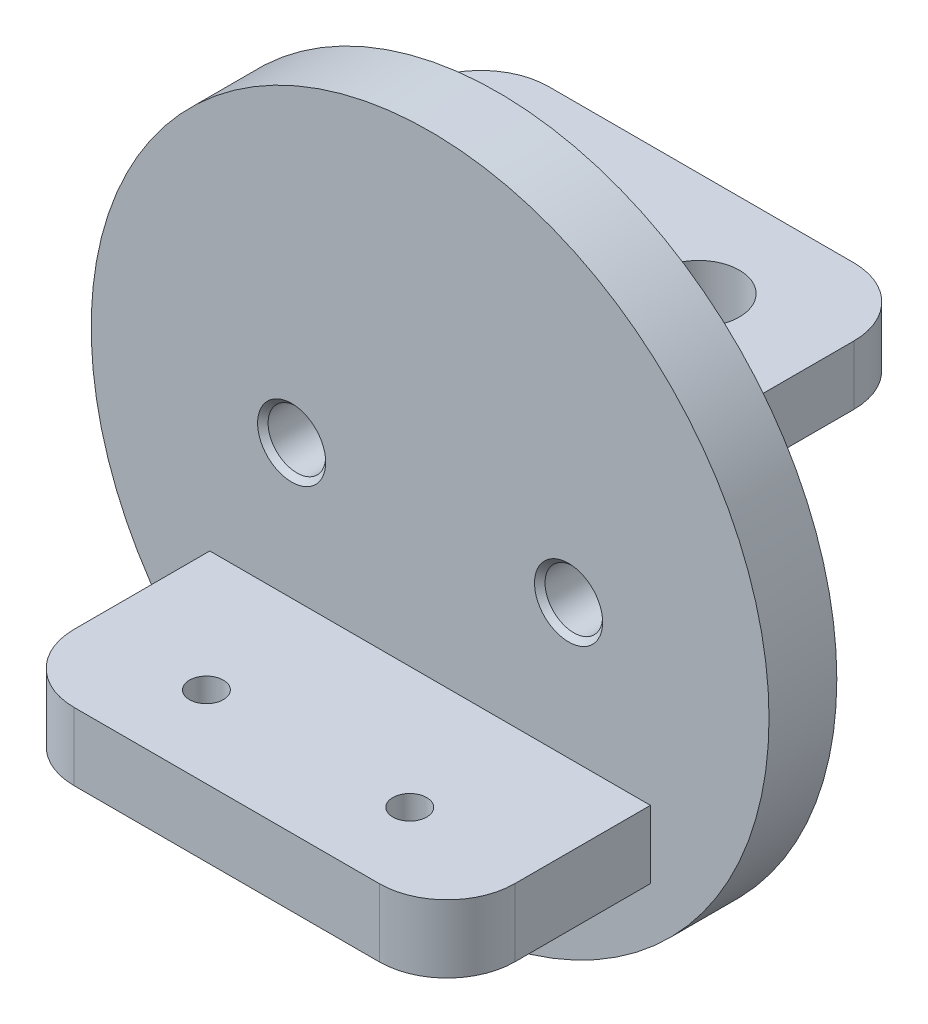
ISO-10303-21;
HEADER;
FILE_DESCRIPTION(('STEP AP214'),'2;1');
FILE_NAME('part.step','',(''),(''),'','','');
FILE_SCHEMA(('AUTOMOTIVE_DESIGN { 1 0 10303 214 1 1 1 1 }'));
ENDSEC;
DATA;
#1=APPLICATION_CONTEXT('core data for automotive mechanical design processes');
#2=APPLICATION_PROTOCOL_DEFINITION('international standard','automotive_design',2000,#1);
#3=PRODUCT_CONTEXT('',#1,'mechanical');
#4=PRODUCT('Part','Part','',(#3));
#5=PRODUCT_RELATED_PRODUCT_CATEGORY('part','',(#4));
#6=PRODUCT_DEFINITION_FORMATION('','',#4);
#7=PRODUCT_DEFINITION_CONTEXT('part definition',#1,'design');
#8=PRODUCT_DEFINITION('design','',#6,#7);
#9=PRODUCT_DEFINITION_SHAPE('','',#8);
#10=(LENGTH_UNIT() NAMED_UNIT(*) SI_UNIT(.MILLI.,.METRE.));
#11=(NAMED_UNIT(*) PLANE_ANGLE_UNIT() SI_UNIT($,.RADIAN.));
#12=(NAMED_UNIT(*) SI_UNIT($,.STERADIAN.) SOLID_ANGLE_UNIT());
#13=UNCERTAINTY_MEASURE_WITH_UNIT(LENGTH_MEASURE(1.E-05),#10,'distance_accuracy_value','');
#14=(GEOMETRIC_REPRESENTATION_CONTEXT(3) GLOBAL_UNCERTAINTY_ASSIGNED_CONTEXT((#13)) GLOBAL_UNIT_ASSIGNED_CONTEXT((#10,
#11,#12)) REPRESENTATION_CONTEXT('',''));
#15=CARTESIAN_POINT('',(0.,0.,0.));
#16=DIRECTION('',(0.,0.,1.));
#17=DIRECTION('',(1.,0.,0.));
#18=AXIS2_PLACEMENT_3D('',#15,#16,#17);
#19=CARTESIAN_POINT('',(0.,0.,10.));
#20=DIRECTION('',(0.,0.,-1.));
#21=DIRECTION('',(-1.,0.,0.));
#22=AXIS2_PLACEMENT_3D('',#19,#20,#21);
#23=CYLINDRICAL_SURFACE('',#22,50.);
#24=CARTESIAN_POINT('',(0.,0.,10.));
#25=DIRECTION('',(0.,0.,1.));
#26=DIRECTION('',(1.,0.,0.));
#27=AXIS2_PLACEMENT_3D('',#24,#25,#26);
#28=CIRCLE('',#27,50.);
#29=CARTESIAN_POINT('',(50.,0.,10.));
#30=VERTEX_POINT('',#29);
#31=EDGE_CURVE('E158',#30,#30,#28,.T.);
#32=ORIENTED_EDGE('',*,*,#31,.F.);
#33=EDGE_LOOP('',(#32));
#34=FACE_BOUND('',#33,.T.);
#35=CARTESIAN_POINT('',(0.,0.,0.));
#36=DIRECTION('',(0.,0.,1.));
#37=DIRECTION('',(1.,0.,0.));
#38=AXIS2_PLACEMENT_3D('',#35,#36,#37);
#39=CIRCLE('',#38,50.);
#40=CARTESIAN_POINT('',(50.,0.,0.));
#41=VERTEX_POINT('',#40);
#42=EDGE_CURVE('E265',#41,#41,#39,.T.);
#43=ORIENTED_EDGE('',*,*,#42,.T.);
#44=EDGE_LOOP('',(#43));
#45=FACE_BOUND('',#44,.T.);
#46=ADVANCED_FACE('F45',(#34,#45),#23,.T.);
#47=CARTESIAN_POINT('',(0.,0.,10.));
#48=DIRECTION('',(0.,0.,1.));
#49=DIRECTION('',(1.,0.,0.));
#50=AXIS2_PLACEMENT_3D('',#47,#48,#49);
#51=PLANE('',#50);
#52=DIRECTION('',(1.,0.,0.));
#53=VECTOR('',#52,1.);
#54=CARTESIAN_POINT('',(0.,-19.8649374279627,10.));
#55=LINE('',#54,#53);
#56=CARTESIAN_POINT('',(-32.5,-19.8649374279627,10.));
#57=VERTEX_POINT('',#56);
#58=CARTESIAN_POINT('',(32.5,-19.8649374279627,10.));
#59=VERTEX_POINT('',#58);
#60=EDGE_CURVE('E219',#57,#59,#55,.T.);
#61=ORIENTED_EDGE('',*,*,#60,.T.);
#62=DIRECTION('',(0.,1.,0.));
#63=VECTOR('',#62,1.);
#64=CARTESIAN_POINT('',(32.5,0.,10.));
#65=LINE('',#64,#63);
#66=CARTESIAN_POINT('',(32.5,-29.8649374279627,10.));
#67=VERTEX_POINT('',#66);
#68=EDGE_CURVE('E226',#67,#59,#65,.T.);
#69=ORIENTED_EDGE('',*,*,#68,.F.);
#70=DIRECTION('',(1.,0.,0.));
#71=VECTOR('',#70,1.);
#72=CARTESIAN_POINT('',(0.,-29.8649374279627,10.));
#73=LINE('',#72,#71);
#74=CARTESIAN_POINT('',(-32.5,-29.8649374279627,10.));
#75=VERTEX_POINT('',#74);
#76=EDGE_CURVE('E235',#75,#67,#73,.T.);
#77=ORIENTED_EDGE('',*,*,#76,.F.);
#78=DIRECTION('',(0.,1.,0.));
#79=VECTOR('',#78,1.);
#80=CARTESIAN_POINT('',(-32.5,0.,10.));
#81=LINE('',#80,#79);
#82=EDGE_CURVE('E232',#75,#57,#81,.T.);
#83=ORIENTED_EDGE('',*,*,#82,.T.);
#84=EDGE_LOOP('',(#61,#69,#77,#83));
#85=FACE_BOUND('',#84,.T.);
#86=CARTESIAN_POINT('',(20.4266717285162,0.,10.));
#87=DIRECTION('',(0.,0.,1.));
#88=DIRECTION('',(1.,0.,0.));
#89=AXIS2_PLACEMENT_3D('',#86,#87,#88);
#90=CIRCLE('',#89,5.025);
#91=CARTESIAN_POINT('',(25.4516717285162,0.,10.));
#92=VERTEX_POINT('',#91);
#93=EDGE_CURVE('E247',#92,#92,#90,.T.);
#94=ORIENTED_EDGE('',*,*,#93,.F.);
#95=EDGE_LOOP('',(#94));
#96=FACE_BOUND('',#95,.T.);
#97=CARTESIAN_POINT('',(-20.4266717285162,0.,10.));
#98=DIRECTION('',(0.,0.,1.));
#99=DIRECTION('',(1.,0.,0.));
#100=AXIS2_PLACEMENT_3D('',#97,#98,#99);
#101=CIRCLE('',#100,5.025);
#102=CARTESIAN_POINT('',(-15.4016717285162,0.,10.));
#103=VERTEX_POINT('',#102);
#104=EDGE_CURVE('E256',#103,#103,#101,.T.);
#105=ORIENTED_EDGE('',*,*,#104,.F.);
#106=EDGE_LOOP('',(#105));
#107=FACE_BOUND('',#106,.T.);
#108=ORIENTED_EDGE('',*,*,#31,.T.);
#109=EDGE_LOOP('',(#108));
#110=FACE_BOUND('',#109,.T.);
#111=ADVANCED_FACE('F280',(#85,#96,#107,#110),#51,.T.);
#112=CARTESIAN_POINT('',(0.,0.,0.));
#113=DIRECTION('',(0.,0.,1.));
#114=DIRECTION('',(1.,0.,0.));
#115=AXIS2_PLACEMENT_3D('',#112,#113,#114);
#116=PLANE('',#115);
#117=DIRECTION('',(0.,1.,0.));
#118=VECTOR('',#117,1.);
#119=CARTESIAN_POINT('',(32.5,0.,0.));
#120=LINE('',#119,#118);
#121=CARTESIAN_POINT('',(32.5,15.7061747048768,0.));
#122=VERTEX_POINT('',#121);
#123=CARTESIAN_POINT('',(32.5,24.4566671709914,0.));
#124=VERTEX_POINT('',#123);
#125=EDGE_CURVE('E163',#122,#124,#120,.T.);
#126=ORIENTED_EDGE('',*,*,#125,.T.);
#127=DIRECTION('',(-1.,0.,0.));
#128=VECTOR('',#127,1.);
#129=CARTESIAN_POINT('',(0.,24.4566671709914,0.));
#130=LINE('',#129,#128);
#131=CARTESIAN_POINT('',(-32.5,24.4566671709914,0.));
#132=VERTEX_POINT('',#131);
#133=EDGE_CURVE('E141',#124,#132,#130,.T.);
#134=ORIENTED_EDGE('',*,*,#133,.T.);
#135=DIRECTION('',(0.,-1.,0.));
#136=VECTOR('',#135,1.);
#137=CARTESIAN_POINT('',(-32.5,0.,0.));
#138=LINE('',#137,#136);
#139=CARTESIAN_POINT('',(-32.5,15.7061747048768,0.));
#140=VERTEX_POINT('',#139);
#141=EDGE_CURVE('E151',#132,#140,#138,.T.);
#142=ORIENTED_EDGE('',*,*,#141,.T.);
#143=DIRECTION('',(1.,0.,0.));
#144=VECTOR('',#143,1.);
#145=CARTESIAN_POINT('',(0.,15.7061747048768,0.));
#146=LINE('',#145,#144);
#147=EDGE_CURVE('E157',#140,#122,#146,.T.);
#148=ORIENTED_EDGE('',*,*,#147,.T.);
#149=EDGE_LOOP('',(#126,#134,#142,#148));
#150=FACE_BOUND('',#149,.T.);
#151=CARTESIAN_POINT('',(20.4266717285162,0.,0.));
#152=DIRECTION('',(0.,0.,1.));
#153=DIRECTION('',(1.,0.,0.));
#154=AXIS2_PLACEMENT_3D('',#151,#152,#153);
#155=CIRCLE('',#154,4.25);
#156=CARTESIAN_POINT('',(24.6766717285162,0.,0.));
#157=VERTEX_POINT('',#156);
#158=EDGE_CURVE('E253',#157,#157,#155,.T.);
#159=ORIENTED_EDGE('',*,*,#158,.T.);
#160=EDGE_LOOP('',(#159));
#161=FACE_BOUND('',#160,.T.);
#162=CARTESIAN_POINT('',(-20.4266717285162,0.,0.));
#163=DIRECTION('',(0.,0.,1.));
#164=DIRECTION('',(1.,0.,0.));
#165=AXIS2_PLACEMENT_3D('',#162,#163,#164);
#166=CIRCLE('',#165,4.25);
#167=CARTESIAN_POINT('',(-16.1766717285162,0.,0.));
#168=VERTEX_POINT('',#167);
#169=EDGE_CURVE('E262',#168,#168,#166,.T.);
#170=ORIENTED_EDGE('',*,*,#169,.T.);
#171=EDGE_LOOP('',(#170));
#172=FACE_BOUND('',#171,.T.);
#173=ORIENTED_EDGE('',*,*,#42,.F.);
#174=EDGE_LOOP('',(#173));
#175=FACE_BOUND('',#174,.T.);
#176=ADVANCED_FACE('F160',(#150,#161,#172,#175),#116,.F.);
#177=CARTESIAN_POINT('',(-20.4266717285162,0.,10.));
#178=DIRECTION('',(0.,0.,1.));
#179=DIRECTION('',(1.,0.,0.));
#180=AXIS2_PLACEMENT_3D('',#177,#178,#179);
#181=CYLINDRICAL_SURFACE('',#180,4.25);
#182=ORIENTED_EDGE('',*,*,#169,.F.);
#183=EDGE_LOOP('',(#182));
#184=FACE_BOUND('',#183,.T.);
#185=CARTESIAN_POINT('',(-20.4266717285162,0.,9.225));
#186=DIRECTION('',(0.,0.,1.));
#187=DIRECTION('',(1.,0.,0.));
#188=AXIS2_PLACEMENT_3D('',#185,#186,#187);
#189=CIRCLE('',#188,4.25);
#190=CARTESIAN_POINT('',(-16.1766717285162,0.,9.225));
#191=VERTEX_POINT('',#190);
#192=EDGE_CURVE('E259',#191,#191,#189,.T.);
#193=ORIENTED_EDGE('',*,*,#192,.T.);
#194=EDGE_LOOP('',(#193));
#195=FACE_BOUND('',#194,.T.);
#196=ADVANCED_FACE('F354',(#184,#195),#181,.F.);
#197=CARTESIAN_POINT('',(-20.4266717285162,0.,10.));
#198=DIRECTION('',(0.,0.,1.));
#199=DIRECTION('',(1.,0.,0.));
#200=AXIS2_PLACEMENT_3D('',#197,#198,#199);
#201=CONICAL_SURFACE('',#200,5.025,0.785398163397448);
#202=ORIENTED_EDGE('',*,*,#192,.F.);
#203=EDGE_LOOP('',(#202));
#204=FACE_BOUND('',#203,.T.);
#205=ORIENTED_EDGE('',*,*,#104,.T.);
#206=EDGE_LOOP('',(#205));
#207=FACE_BOUND('',#206,.T.);
#208=ADVANCED_FACE('F350',(#204,#207),#201,.F.);
#209=CARTESIAN_POINT('',(20.4266717285162,0.,10.));
#210=DIRECTION('',(0.,0.,1.));
#211=DIRECTION('',(1.,0.,0.));
#212=AXIS2_PLACEMENT_3D('',#209,#210,#211);
#213=CYLINDRICAL_SURFACE('',#212,4.25);
#214=ORIENTED_EDGE('',*,*,#158,.F.);
#215=EDGE_LOOP('',(#214));
#216=FACE_BOUND('',#215,.T.);
#217=CARTESIAN_POINT('',(20.4266717285162,0.,9.225));
#218=DIRECTION('',(0.,0.,1.));
#219=DIRECTION('',(1.,0.,0.));
#220=AXIS2_PLACEMENT_3D('',#217,#218,#219);
#221=CIRCLE('',#220,4.25);
#222=CARTESIAN_POINT('',(24.6766717285162,0.,9.225));
#223=VERTEX_POINT('',#222);
#224=EDGE_CURVE('E250',#223,#223,#221,.T.);
#225=ORIENTED_EDGE('',*,*,#224,.T.);
#226=EDGE_LOOP('',(#225));
#227=FACE_BOUND('',#226,.T.);
#228=ADVANCED_FACE('F346',(#216,#227),#213,.F.);
#229=CARTESIAN_POINT('',(20.4266717285162,0.,10.));
#230=DIRECTION('',(0.,0.,1.));
#231=DIRECTION('',(1.,0.,0.));
#232=AXIS2_PLACEMENT_3D('',#229,#230,#231);
#233=CONICAL_SURFACE('',#232,5.025,0.785398163397448);
#234=ORIENTED_EDGE('',*,*,#224,.F.);
#235=EDGE_LOOP('',(#234));
#236=FACE_BOUND('',#235,.T.);
#237=ORIENTED_EDGE('',*,*,#93,.T.);
#238=EDGE_LOOP('',(#237));
#239=FACE_BOUND('',#238,.T.);
#240=ADVANCED_FACE('F342',(#236,#239),#233,.F.);
#241=CARTESIAN_POINT('',(0.,-19.8649374279627,40.));
#242=DIRECTION('',(0.,1.,0.));
#243=DIRECTION('',(0.,0.,1.));
#244=AXIS2_PLACEMENT_3D('',#241,#242,#243);
#245=PLANE('',#244);
#246=CARTESIAN_POINT('',(-15.,-19.8649374279627,28.));
#247=DIRECTION('',(0.,1.,0.));
#248=DIRECTION('',(0.,0.,1.));
#249=AXIS2_PLACEMENT_3D('',#246,#247,#248);
#250=CIRCLE('',#249,2.5);
#251=CARTESIAN_POINT('',(-15.,-19.8649374279627,30.5));
#252=VERTEX_POINT('',#251);
#253=EDGE_CURVE('E213',#252,#252,#250,.F.);
#254=ORIENTED_EDGE('',*,*,#253,.T.);
#255=EDGE_LOOP('',(#254));
#256=FACE_BOUND('',#255,.T.);
#257=CARTESIAN_POINT('',(15.,-19.8649374279627,28.));
#258=DIRECTION('',(0.,1.,0.));
#259=DIRECTION('',(0.,0.,1.));
#260=AXIS2_PLACEMENT_3D('',#257,#258,#259);
#261=CIRCLE('',#260,2.5);
#262=CARTESIAN_POINT('',(15.,-19.8649374279627,30.5));
#263=VERTEX_POINT('',#262);
#264=EDGE_CURVE('E216',#263,#263,#261,.F.);
#265=ORIENTED_EDGE('',*,*,#264,.T.);
#266=EDGE_LOOP('',(#265));
#267=FACE_BOUND('',#266,.T.);
#268=DIRECTION('',(1.,0.,0.));
#269=VECTOR('',#268,1.);
#270=CARTESIAN_POINT('',(0.,-19.8649374279627,40.));
#271=LINE('',#270,#269);
#272=CARTESIAN_POINT('',(-22.5,-19.8649374279627,40.));
#273=VERTEX_POINT('',#272);
#274=CARTESIAN_POINT('',(22.5,-19.8649374279627,40.));
#275=VERTEX_POINT('',#274);
#276=EDGE_CURVE('E222',#273,#275,#271,.T.);
#277=ORIENTED_EDGE('',*,*,#276,.T.);
#278=CARTESIAN_POINT('',(22.5,-19.8649374279627,30.));
#279=DIRECTION('',(0.,1.,0.));
#280=DIRECTION('',(0.,0.,1.));
#281=AXIS2_PLACEMENT_3D('',#278,#279,#280);
#282=CIRCLE('',#281,10.);
#283=CARTESIAN_POINT('',(32.5,-19.8649374279627,30.));
#284=VERTEX_POINT('',#283);
#285=EDGE_CURVE('E175',#275,#284,#282,.T.);
#286=ORIENTED_EDGE('',*,*,#285,.T.);
#287=DIRECTION('',(0.,0.,-1.));
#288=VECTOR('',#287,1.);
#289=CARTESIAN_POINT('',(32.5,-19.8649374279627,40.));
#290=LINE('',#289,#288);
#291=EDGE_CURVE('E229',#284,#59,#290,.T.);
#292=ORIENTED_EDGE('',*,*,#291,.T.);
#293=ORIENTED_EDGE('',*,*,#60,.F.);
#294=DIRECTION('',(0.,0.,-1.));
#295=VECTOR('',#294,1.);
#296=CARTESIAN_POINT('',(-32.5,-19.8649374279627,40.));
#297=LINE('',#296,#295);
#298=CARTESIAN_POINT('',(-32.5,-19.8649374279627,30.));
#299=VERTEX_POINT('',#298);
#300=EDGE_CURVE('E245',#299,#57,#297,.T.);
#301=ORIENTED_EDGE('',*,*,#300,.F.);
#302=CARTESIAN_POINT('',(-22.5,-19.8649374279627,30.));
#303=DIRECTION('',(0.,1.,0.));
#304=DIRECTION('',(0.,0.,1.));
#305=AXIS2_PLACEMENT_3D('',#302,#303,#304);
#306=CIRCLE('',#305,10.);
#307=EDGE_CURVE('E173',#299,#273,#306,.T.);
#308=ORIENTED_EDGE('',*,*,#307,.T.);
#309=EDGE_LOOP('',(#277,#286,#292,#293,#301,#308));
#310=FACE_BOUND('',#309,.T.);
#311=ADVANCED_FACE('F324',(#256,#267,#310),#245,.T.);
#312=CARTESIAN_POINT('',(-32.5,0.,40.));
#313=DIRECTION('',(-1.,0.,0.));
#314=DIRECTION('',(0.,0.,1.));
#315=AXIS2_PLACEMENT_3D('',#312,#313,#314);
#316=PLANE('',#315);
#317=DIRECTION('',(0.,0.,-1.));
#318=VECTOR('',#317,1.);
#319=CARTESIAN_POINT('',(-32.5,-29.8649374279627,40.));
#320=LINE('',#319,#318);
#321=CARTESIAN_POINT('',(-32.5,-29.8649374279627,30.));
#322=VERTEX_POINT('',#321);
#323=EDGE_CURVE('E243',#322,#75,#320,.T.);
#324=ORIENTED_EDGE('',*,*,#323,.F.);
#325=DIRECTION('',(0.,1.,0.));
#326=VECTOR('',#325,1.);
#327=CARTESIAN_POINT('',(-32.5,0.,30.));
#328=LINE('',#327,#326);
#329=EDGE_CURVE('E183',#322,#299,#328,.T.);
#330=ORIENTED_EDGE('',*,*,#329,.T.);
#331=ORIENTED_EDGE('',*,*,#300,.T.);
#332=ORIENTED_EDGE('',*,*,#82,.F.);
#333=EDGE_LOOP('',(#324,#330,#331,#332));
#334=FACE_BOUND('',#333,.T.);
#335=ADVANCED_FACE('F310',(#334),#316,.T.);
#336=CARTESIAN_POINT('',(0.,-29.8649374279627,40.));
#337=DIRECTION('',(0.,1.,0.));
#338=DIRECTION('',(0.,0.,1.));
#339=AXIS2_PLACEMENT_3D('',#336,#337,#338);
#340=PLANE('',#339);
#341=CARTESIAN_POINT('',(-15.,-29.8649374279627,28.));
#342=DIRECTION('',(0.,-1.,0.));
#343=DIRECTION('',(0.,0.,-1.));
#344=AXIS2_PLACEMENT_3D('',#341,#342,#343);
#345=CIRCLE('',#344,2.5);
#346=CARTESIAN_POINT('',(-15.,-29.8649374279627,25.5));
#347=VERTEX_POINT('',#346);
#348=EDGE_CURVE('E209',#347,#347,#345,.T.);
#349=ORIENTED_EDGE('',*,*,#348,.F.);
#350=EDGE_LOOP('',(#349));
#351=FACE_BOUND('',#350,.T.);
#352=CARTESIAN_POINT('',(15.,-29.8649374279627,28.));
#353=DIRECTION('',(0.,-1.,0.));
#354=DIRECTION('',(0.,0.,1.));
#355=AXIS2_PLACEMENT_3D('',#352,#353,#354);
#356=CIRCLE('',#355,2.5);
#357=CARTESIAN_POINT('',(15.,-29.8649374279627,30.5));
#358=VERTEX_POINT('',#357);
#359=EDGE_CURVE('E551',#358,#358,#356,.T.);
#360=ORIENTED_EDGE('',*,*,#359,.F.);
#361=EDGE_LOOP('',(#360));
#362=FACE_BOUND('',#361,.T.);
#363=DIRECTION('',(0.,0.,-1.));
#364=VECTOR('',#363,1.);
#365=CARTESIAN_POINT('',(32.5,-29.8649374279627,40.));
#366=LINE('',#365,#364);
#367=CARTESIAN_POINT('',(32.5,-29.8649374279627,30.));
#368=VERTEX_POINT('',#367);
#369=EDGE_CURVE('E241',#368,#67,#366,.T.);
#370=ORIENTED_EDGE('',*,*,#369,.F.);
#371=CARTESIAN_POINT('',(22.5,-29.8649374279627,30.));
#372=DIRECTION('',(0.,1.,0.));
#373=DIRECTION('',(0.,0.,1.));
#374=AXIS2_PLACEMENT_3D('',#371,#372,#373);
#375=CIRCLE('',#374,10.);
#376=CARTESIAN_POINT('',(22.5,-29.8649374279627,40.));
#377=VERTEX_POINT('',#376);
#378=EDGE_CURVE('E181',#368,#377,#375,.F.);
#379=ORIENTED_EDGE('',*,*,#378,.T.);
#380=DIRECTION('',(1.,0.,0.));
#381=VECTOR('',#380,1.);
#382=CARTESIAN_POINT('',(0.,-29.8649374279627,40.));
#383=LINE('',#382,#381);
#384=CARTESIAN_POINT('',(-22.5,-29.8649374279627,40.));
#385=VERTEX_POINT('',#384);
#386=EDGE_CURVE('E225',#385,#377,#383,.T.);
#387=ORIENTED_EDGE('',*,*,#386,.F.);
#388=CARTESIAN_POINT('',(-22.5,-29.8649374279627,30.));
#389=DIRECTION('',(0.,1.,0.));
#390=DIRECTION('',(0.,0.,1.));
#391=AXIS2_PLACEMENT_3D('',#388,#389,#390);
#392=CIRCLE('',#391,10.);
#393=EDGE_CURVE('E179',#385,#322,#392,.F.);
#394=ORIENTED_EDGE('',*,*,#393,.T.);
#395=ORIENTED_EDGE('',*,*,#323,.T.);
#396=ORIENTED_EDGE('',*,*,#76,.T.);
#397=EDGE_LOOP('',(#370,#379,#387,#394,#395,#396));
#398=FACE_BOUND('',#397,.T.);
#399=ADVANCED_FACE('F307',(#351,#362,#398),#340,.F.);
#400=CARTESIAN_POINT('',(32.5,0.,40.));
#401=DIRECTION('',(-1.,0.,0.));
#402=DIRECTION('',(0.,0.,1.));
#403=AXIS2_PLACEMENT_3D('',#400,#401,#402);
#404=PLANE('',#403);
#405=ORIENTED_EDGE('',*,*,#291,.F.);
#406=DIRECTION('',(0.,1.,0.));
#407=VECTOR('',#406,1.);
#408=CARTESIAN_POINT('',(32.5,-29.8649374279627,30.));
#409=LINE('',#408,#407);
#410=EDGE_CURVE('E177',#284,#368,#409,.F.);
#411=ORIENTED_EDGE('',*,*,#410,.T.);
#412=ORIENTED_EDGE('',*,*,#369,.T.);
#413=ORIENTED_EDGE('',*,*,#68,.T.);
#414=EDGE_LOOP('',(#405,#411,#412,#413));
#415=FACE_BOUND('',#414,.T.);
#416=ADVANCED_FACE('F326',(#415),#404,.F.);
#417=CARTESIAN_POINT('',(0.,0.,40.));
#418=DIRECTION('',(0.,0.,1.));
#419=DIRECTION('',(1.,0.,0.));
#420=AXIS2_PLACEMENT_3D('',#417,#418,#419);
#421=PLANE('',#420);
#422=ORIENTED_EDGE('',*,*,#386,.T.);
#423=DIRECTION('',(0.,1.,0.));
#424=VECTOR('',#423,1.);
#425=CARTESIAN_POINT('',(22.5,-19.8649374279627,40.));
#426=LINE('',#425,#424);
#427=EDGE_CURVE('E166',#377,#275,#426,.T.);
#428=ORIENTED_EDGE('',*,*,#427,.T.);
#429=ORIENTED_EDGE('',*,*,#276,.F.);
#430=DIRECTION('',(0.,1.,0.));
#431=VECTOR('',#430,1.);
#432=CARTESIAN_POINT('',(-22.5,0.,40.));
#433=LINE('',#432,#431);
#434=EDGE_CURVE('E164',#273,#385,#433,.F.);
#435=ORIENTED_EDGE('',*,*,#434,.T.);
#436=EDGE_LOOP('',(#422,#428,#429,#435));
#437=FACE_BOUND('',#436,.T.);
#438=ADVANCED_FACE('F322',(#437),#421,.T.);
#439=CARTESIAN_POINT('',(-32.5,24.4566671709914,-30.));
#440=DIRECTION('',(0.,1.,0.));
#441=DIRECTION('',(0.,0.,1.));
#442=AXIS2_PLACEMENT_3D('',#439,#440,#441);
#443=PLANE('',#442);
#444=CARTESIAN_POINT('',(-15.,24.4566671709914,-14.6157290173434));
#445=DIRECTION('',(0.,1.,0.));
#446=DIRECTION('',(0.,0.,1.));
#447=AXIS2_PLACEMENT_3D('',#444,#445,#446);
#448=CIRCLE('',#447,6.);
#449=CARTESIAN_POINT('',(-15.,24.4566671709914,-8.61572901734342));
#450=VERTEX_POINT('',#449);
#451=EDGE_CURVE('E548',#450,#450,#448,.T.);
#452=ORIENTED_EDGE('',*,*,#451,.F.);
#453=EDGE_LOOP('',(#452));
#454=FACE_BOUND('',#453,.T.);
#455=CARTESIAN_POINT('',(15.,24.4566671709914,-14.6157290173434));
#456=DIRECTION('',(0.,1.,0.));
#457=DIRECTION('',(0.,0.,-1.));
#458=AXIS2_PLACEMENT_3D('',#455,#456,#457);
#459=CIRCLE('',#458,6.);
#460=CARTESIAN_POINT('',(15.,24.4566671709914,-20.6157290173434));
#461=VERTEX_POINT('',#460);
#462=EDGE_CURVE('E552',#461,#461,#459,.T.);
#463=ORIENTED_EDGE('',*,*,#462,.F.);
#464=EDGE_LOOP('',(#463));
#465=FACE_BOUND('',#464,.T.);
#466=DIRECTION('',(0.,0.,1.));
#467=VECTOR('',#466,1.);
#468=CARTESIAN_POINT('',(32.5,24.4566671709914,-30.));
#469=LINE('',#468,#467);
#470=CARTESIAN_POINT('',(32.5,24.4566671709914,-20.));
#471=VERTEX_POINT('',#470);
#472=EDGE_CURVE('E204',#471,#124,#469,.T.);
#473=ORIENTED_EDGE('',*,*,#472,.F.);
#474=CARTESIAN_POINT('',(22.5,24.4566671709914,-20.));
#475=DIRECTION('',(0.,1.,0.));
#476=DIRECTION('',(0.,0.,1.));
#477=AXIS2_PLACEMENT_3D('',#474,#475,#476);
#478=CIRCLE('',#477,10.);
#479=CARTESIAN_POINT('',(22.5,24.4566671709914,-30.));
#480=VERTEX_POINT('',#479);
#481=EDGE_CURVE('E190',#471,#480,#478,.T.);
#482=ORIENTED_EDGE('',*,*,#481,.T.);
#483=DIRECTION('',(-1.,0.,0.));
#484=VECTOR('',#483,1.);
#485=CARTESIAN_POINT('',(-32.5,24.4566671709914,-30.));
#486=LINE('',#485,#484);
#487=CARTESIAN_POINT('',(-22.5,24.4566671709914,-30.));
#488=VERTEX_POINT('',#487);
#489=EDGE_CURVE('E207',#480,#488,#486,.T.);
#490=ORIENTED_EDGE('',*,*,#489,.T.);
#491=CARTESIAN_POINT('',(-22.5,24.4566671709914,-20.));
#492=DIRECTION('',(0.,1.,0.));
#493=DIRECTION('',(0.,0.,1.));
#494=AXIS2_PLACEMENT_3D('',#491,#492,#493);
#495=CIRCLE('',#494,10.);
#496=CARTESIAN_POINT('',(-32.5,24.4566671709914,-20.));
#497=VERTEX_POINT('',#496);
#498=EDGE_CURVE('E145',#488,#497,#495,.T.);
#499=ORIENTED_EDGE('',*,*,#498,.T.);
#500=DIRECTION('',(0.,0.,1.));
#501=VECTOR('',#500,1.);
#502=CARTESIAN_POINT('',(-32.5,24.4566671709914,-30.));
#503=LINE('',#502,#501);
#504=EDGE_CURVE('E136',#497,#132,#503,.T.);
#505=ORIENTED_EDGE('',*,*,#504,.T.);
#506=ORIENTED_EDGE('',*,*,#133,.F.);
#507=EDGE_LOOP('',(#473,#482,#490,#499,#505,#506));
#508=FACE_BOUND('',#507,.T.);
#509=ADVANCED_FACE('F139',(#454,#465,#508),#443,.T.);
#510=CARTESIAN_POINT('',(32.5,24.4566671709914,-30.));
#511=DIRECTION('',(1.,0.,0.));
#512=DIRECTION('',(0.,0.,-1.));
#513=AXIS2_PLACEMENT_3D('',#510,#511,#512);
#514=PLANE('',#513);
#515=DIRECTION('',(0.,0.,1.));
#516=VECTOR('',#515,1.);
#517=CARTESIAN_POINT('',(32.5,15.7061747048768,-30.));
#518=LINE('',#517,#516);
#519=CARTESIAN_POINT('',(32.5,15.7061747048768,-20.));
#520=VERTEX_POINT('',#519);
#521=EDGE_CURVE('E199',#520,#122,#518,.T.);
#522=ORIENTED_EDGE('',*,*,#521,.F.);
#523=DIRECTION('',(0.,1.,0.));
#524=VECTOR('',#523,1.);
#525=CARTESIAN_POINT('',(32.5,24.4566671709914,-20.));
#526=LINE('',#525,#524);
#527=EDGE_CURVE('E186',#520,#471,#526,.T.);
#528=ORIENTED_EDGE('',*,*,#527,.T.);
#529=ORIENTED_EDGE('',*,*,#472,.T.);
#530=ORIENTED_EDGE('',*,*,#125,.F.);
#531=EDGE_LOOP('',(#522,#528,#529,#530));
#532=FACE_BOUND('',#531,.T.);
#533=ADVANCED_FACE('F203',(#532),#514,.T.);
#534=CARTESIAN_POINT('',(-32.5,15.7061747048768,-30.));
#535=DIRECTION('',(0.,-1.,0.));
#536=DIRECTION('',(0.,0.,-1.));
#537=AXIS2_PLACEMENT_3D('',#534,#535,#536);
#538=PLANE('',#537);
#539=CARTESIAN_POINT('',(-15.,15.7061747048768,-14.6157290173434));
#540=DIRECTION('',(0.,-1.,0.));
#541=DIRECTION('',(0.,0.,-1.));
#542=AXIS2_PLACEMENT_3D('',#539,#540,#541);
#543=CIRCLE('',#542,6.);
#544=CARTESIAN_POINT('',(-15.,15.7061747048768,-20.6157290173434));
#545=VERTEX_POINT('',#544);
#546=EDGE_CURVE('E545',#545,#545,#543,.F.);
#547=ORIENTED_EDGE('',*,*,#546,.T.);
#548=EDGE_LOOP('',(#547));
#549=FACE_BOUND('',#548,.T.);
#550=CARTESIAN_POINT('',(15.,15.7061747048768,-14.6157290173434));
#551=DIRECTION('',(0.,-1.,0.));
#552=DIRECTION('',(0.,0.,-1.));
#553=AXIS2_PLACEMENT_3D('',#550,#551,#552);
#554=CIRCLE('',#553,6.);
#555=CARTESIAN_POINT('',(15.,15.7061747048768,-20.6157290173434));
#556=VERTEX_POINT('',#555);
#557=EDGE_CURVE('E557',#556,#556,#554,.F.);
#558=ORIENTED_EDGE('',*,*,#557,.T.);
#559=EDGE_LOOP('',(#558));
#560=FACE_BOUND('',#559,.T.);
#561=DIRECTION('',(1.,0.,0.));
#562=VECTOR('',#561,1.);
#563=CARTESIAN_POINT('',(-32.5,15.7061747048768,-30.));
#564=LINE('',#563,#562);
#565=CARTESIAN_POINT('',(-22.5,15.7061747048768,-30.));
#566=VERTEX_POINT('',#565);
#567=CARTESIAN_POINT('',(22.5,15.7061747048768,-30.));
#568=VERTEX_POINT('',#567);
#569=EDGE_CURVE('E148',#566,#568,#564,.T.);
#570=ORIENTED_EDGE('',*,*,#569,.T.);
#571=CARTESIAN_POINT('',(22.5,15.7061747048768,-20.));
#572=DIRECTION('',(0.,-1.,0.));
#573=DIRECTION('',(0.,0.,-1.));
#574=AXIS2_PLACEMENT_3D('',#571,#572,#573);
#575=CIRCLE('',#574,10.);
#576=EDGE_CURVE('E53',#568,#520,#575,.T.);
#577=ORIENTED_EDGE('',*,*,#576,.T.);
#578=ORIENTED_EDGE('',*,*,#521,.T.);
#579=ORIENTED_EDGE('',*,*,#147,.F.);
#580=DIRECTION('',(0.,0.,1.));
#581=VECTOR('',#580,1.);
#582=CARTESIAN_POINT('',(-32.5,15.7061747048768,-30.));
#583=LINE('',#582,#581);
#584=CARTESIAN_POINT('',(-32.5,15.7061747048768,-20.));
#585=VERTEX_POINT('',#584);
#586=EDGE_CURVE('E147',#585,#140,#583,.T.);
#587=ORIENTED_EDGE('',*,*,#586,.F.);
#588=CARTESIAN_POINT('',(-22.5,15.7061747048768,-20.));
#589=DIRECTION('',(0.,-1.,0.));
#590=DIRECTION('',(0.,0.,-1.));
#591=AXIS2_PLACEMENT_3D('',#588,#589,#590);
#592=CIRCLE('',#591,10.);
#593=EDGE_CURVE('E60',#585,#566,#592,.T.);
#594=ORIENTED_EDGE('',*,*,#593,.T.);
#595=EDGE_LOOP('',(#570,#577,#578,#579,#587,#594));
#596=FACE_BOUND('',#595,.T.);
#597=ADVANCED_FACE('F198',(#549,#560,#596),#538,.T.);
#598=CARTESIAN_POINT('',(-32.5,24.4566671709914,-30.));
#599=DIRECTION('',(-1.,0.,0.));
#600=DIRECTION('',(0.,-1.,0.));
#601=AXIS2_PLACEMENT_3D('',#598,#599,#600);
#602=PLANE('',#601);
#603=ORIENTED_EDGE('',*,*,#504,.F.);
#604=DIRECTION('',(0.,-1.,0.));
#605=VECTOR('',#604,1.);
#606=CARTESIAN_POINT('',(-32.5,24.4566671709914,-20.));
#607=LINE('',#606,#605);
#608=EDGE_CURVE('E11',#497,#585,#607,.T.);
#609=ORIENTED_EDGE('',*,*,#608,.T.);
#610=ORIENTED_EDGE('',*,*,#586,.T.);
#611=ORIENTED_EDGE('',*,*,#141,.F.);
#612=EDGE_LOOP('',(#603,#609,#610,#611));
#613=FACE_BOUND('',#612,.T.);
#614=ADVANCED_FACE('F152',(#613),#602,.T.);
#615=CARTESIAN_POINT('',(0.,0.,-30.));
#616=DIRECTION('',(0.,0.,-1.));
#617=DIRECTION('',(-1.,0.,0.));
#618=AXIS2_PLACEMENT_3D('',#615,#616,#617);
#619=PLANE('',#618);
#620=ORIENTED_EDGE('',*,*,#489,.F.);
#621=DIRECTION('',(0.,1.,0.));
#622=VECTOR('',#621,1.);
#623=CARTESIAN_POINT('',(22.5,0.,-30.));
#624=LINE('',#623,#622);
#625=EDGE_CURVE('E67',#480,#568,#624,.F.);
#626=ORIENTED_EDGE('',*,*,#625,.T.);
#627=ORIENTED_EDGE('',*,*,#569,.F.);
#628=DIRECTION('',(0.,-1.,0.));
#629=VECTOR('',#628,1.);
#630=CARTESIAN_POINT('',(-22.5,0.,-30.));
#631=LINE('',#630,#629);
#632=EDGE_CURVE('E192',#566,#488,#631,.F.);
#633=ORIENTED_EDGE('',*,*,#632,.T.);
#634=EDGE_LOOP('',(#620,#626,#627,#633));
#635=FACE_BOUND('',#634,.T.);
#636=ADVANCED_FACE('F208',(#635),#619,.T.);
#637=CARTESIAN_POINT('',(22.5,0.,30.));
#638=DIRECTION('',(0.,-1.,0.));
#639=DIRECTION('',(0.,0.,-1.));
#640=AXIS2_PLACEMENT_3D('',#637,#638,#639);
#641=CYLINDRICAL_SURFACE('',#640,10.);
#642=ORIENTED_EDGE('',*,*,#378,.F.);
#643=ORIENTED_EDGE('',*,*,#410,.F.);
#644=ORIENTED_EDGE('',*,*,#285,.F.);
#645=ORIENTED_EDGE('',*,*,#427,.F.);
#646=EDGE_LOOP('',(#642,#643,#644,#645));
#647=FACE_BOUND('',#646,.T.);
#648=ADVANCED_FACE('F292',(#647),#641,.T.);
#649=CARTESIAN_POINT('',(-22.5,0.,30.));
#650=DIRECTION('',(0.,1.,0.));
#651=DIRECTION('',(0.,0.,1.));
#652=AXIS2_PLACEMENT_3D('',#649,#650,#651);
#653=CYLINDRICAL_SURFACE('',#652,10.);
#654=ORIENTED_EDGE('',*,*,#393,.F.);
#655=ORIENTED_EDGE('',*,*,#434,.F.);
#656=ORIENTED_EDGE('',*,*,#307,.F.);
#657=ORIENTED_EDGE('',*,*,#329,.F.);
#658=EDGE_LOOP('',(#654,#655,#656,#657));
#659=FACE_BOUND('',#658,.T.);
#660=ADVANCED_FACE('F278',(#659),#653,.T.);
#661=CARTESIAN_POINT('',(22.5,24.4566671709914,-20.));
#662=DIRECTION('',(0.,1.,0.));
#663=DIRECTION('',(0.,0.,1.));
#664=AXIS2_PLACEMENT_3D('',#661,#662,#663);
#665=CYLINDRICAL_SURFACE('',#664,10.);
#666=ORIENTED_EDGE('',*,*,#576,.F.);
#667=ORIENTED_EDGE('',*,*,#625,.F.);
#668=ORIENTED_EDGE('',*,*,#481,.F.);
#669=ORIENTED_EDGE('',*,*,#527,.F.);
#670=EDGE_LOOP('',(#666,#667,#668,#669));
#671=FACE_BOUND('',#670,.T.);
#672=ADVANCED_FACE('F206',(#671),#665,.T.);
#673=CARTESIAN_POINT('',(-22.5,24.4566671709914,-20.));
#674=DIRECTION('',(0.,-1.,0.));
#675=DIRECTION('',(1.,0.,0.));
#676=AXIS2_PLACEMENT_3D('',#673,#674,#675);
#677=CYLINDRICAL_SURFACE('',#676,10.);
#678=ORIENTED_EDGE('',*,*,#498,.F.);
#679=ORIENTED_EDGE('',*,*,#632,.F.);
#680=ORIENTED_EDGE('',*,*,#593,.F.);
#681=ORIENTED_EDGE('',*,*,#608,.F.);
#682=EDGE_LOOP('',(#678,#679,#680,#681));
#683=FACE_BOUND('',#682,.T.);
#684=ADVANCED_FACE('F47',(#683),#677,.T.);
#685=CARTESIAN_POINT('',(15.,50.001,28.));
#686=DIRECTION('',(0.,-1.,0.));
#687=DIRECTION('',(0.,0.,-1.));
#688=AXIS2_PLACEMENT_3D('',#685,#686,#687);
#689=CYLINDRICAL_SURFACE('',#688,2.5);
#690=ORIENTED_EDGE('',*,*,#264,.F.);
#691=EDGE_LOOP('',(#690));
#692=FACE_BOUND('',#691,.T.);
#693=ORIENTED_EDGE('',*,*,#359,.T.);
#694=EDGE_LOOP('',(#693));
#695=FACE_BOUND('',#694,.T.);
#696=ADVANCED_FACE('F270',(#692,#695),#689,.F.);
#697=CARTESIAN_POINT('',(-15.,50.001,28.));
#698=DIRECTION('',(0.,-1.,0.));
#699=DIRECTION('',(0.,0.,-1.));
#700=AXIS2_PLACEMENT_3D('',#697,#698,#699);
#701=CYLINDRICAL_SURFACE('',#700,2.5);
#702=ORIENTED_EDGE('',*,*,#253,.F.);
#703=EDGE_LOOP('',(#702));
#704=FACE_BOUND('',#703,.T.);
#705=ORIENTED_EDGE('',*,*,#348,.T.);
#706=EDGE_LOOP('',(#705));
#707=FACE_BOUND('',#706,.T.);
#708=ADVANCED_FACE('F275',(#704,#707),#701,.F.);
#709=CARTESIAN_POINT('',(15.,-50.001,-14.6157290173434));
#710=DIRECTION('',(0.,1.,0.));
#711=DIRECTION('',(0.,0.,1.));
#712=AXIS2_PLACEMENT_3D('',#709,#710,#711);
#713=CYLINDRICAL_SURFACE('',#712,6.);
#714=ORIENTED_EDGE('',*,*,#557,.F.);
#715=EDGE_LOOP('',(#714));
#716=FACE_BOUND('',#715,.T.);
#717=ORIENTED_EDGE('',*,*,#462,.T.);
#718=EDGE_LOOP('',(#717));
#719=FACE_BOUND('',#718,.T.);
#720=ADVANCED_FACE('F449',(#716,#719),#713,.F.);
#721=CARTESIAN_POINT('',(-15.,-50.001,-14.6157290173434));
#722=DIRECTION('',(0.,1.,0.));
#723=DIRECTION('',(0.,0.,1.));
#724=AXIS2_PLACEMENT_3D('',#721,#722,#723);
#725=CYLINDRICAL_SURFACE('',#724,6.);
#726=ORIENTED_EDGE('',*,*,#546,.F.);
#727=EDGE_LOOP('',(#726));
#728=FACE_BOUND('',#727,.T.);
#729=ORIENTED_EDGE('',*,*,#451,.T.);
#730=EDGE_LOOP('',(#729));
#731=FACE_BOUND('',#730,.T.);
#732=ADVANCED_FACE('F481',(#728,#731),#725,.F.);
#733=CLOSED_SHELL('',(#46,#111,#176,#196,#208,#228,#240,#311,#335,#399,#416,#438,#509,#533,#597,
#614,#636,#648,#660,#672,#684,#696,#708,#720,#732));
#734=MANIFOLD_SOLID_BREP('B2',#733);
#735=ADVANCED_BREP_SHAPE_REPRESENTATION('',(#18,#734),#14);
#736=SHAPE_DEFINITION_REPRESENTATION(#9,#735);
ENDSEC;
END-ISO-10303-21;
